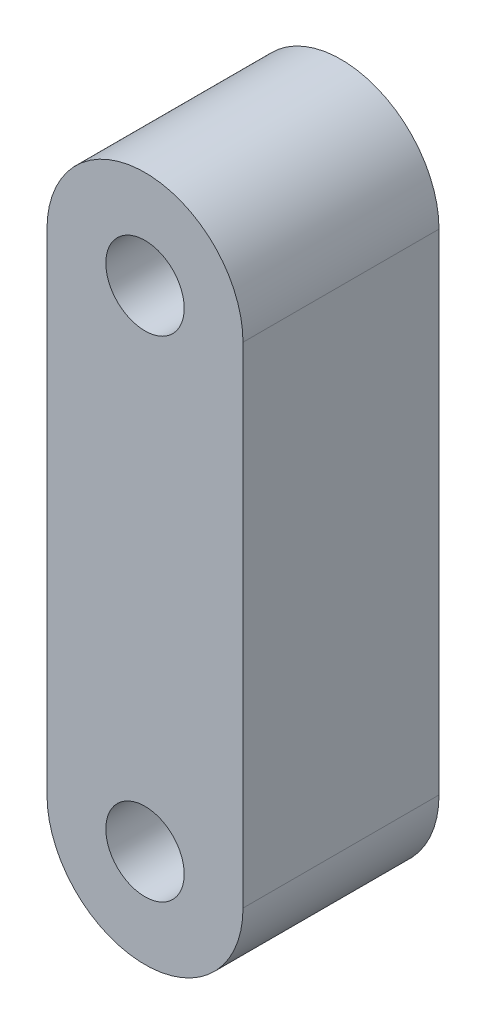
ISO-10303-21;
HEADER;
FILE_DESCRIPTION(('STEP AP214'),'2;1');
FILE_NAME('part.step','',(''),(''),'','','');
FILE_SCHEMA(('AUTOMOTIVE_DESIGN { 1 0 10303 214 1 1 1 1 }'));
ENDSEC;
DATA;
#1=APPLICATION_CONTEXT('core data for automotive mechanical design processes');
#2=APPLICATION_PROTOCOL_DEFINITION('international standard','automotive_design',2000,#1);
#3=PRODUCT_CONTEXT('',#1,'mechanical');
#4=PRODUCT('Part','Part','',(#3));
#5=PRODUCT_RELATED_PRODUCT_CATEGORY('part','',(#4));
#6=PRODUCT_DEFINITION_FORMATION('','',#4);
#7=PRODUCT_DEFINITION_CONTEXT('part definition',#1,'design');
#8=PRODUCT_DEFINITION('design','',#6,#7);
#9=PRODUCT_DEFINITION_SHAPE('','',#8);
#10=(LENGTH_UNIT() NAMED_UNIT(*) SI_UNIT(.MILLI.,.METRE.));
#11=(NAMED_UNIT(*) PLANE_ANGLE_UNIT() SI_UNIT($,.RADIAN.));
#12=(NAMED_UNIT(*) SI_UNIT($,.STERADIAN.) SOLID_ANGLE_UNIT());
#13=UNCERTAINTY_MEASURE_WITH_UNIT(LENGTH_MEASURE(1.E-05),#10,'distance_accuracy_value','');
#14=(GEOMETRIC_REPRESENTATION_CONTEXT(3) GLOBAL_UNCERTAINTY_ASSIGNED_CONTEXT((#13)) GLOBAL_UNIT_ASSIGNED_CONTEXT((#10,
#11,#12)) REPRESENTATION_CONTEXT('',''));
#15=CARTESIAN_POINT('',(0.,0.,0.));
#16=DIRECTION('',(0.,0.,1.));
#17=DIRECTION('',(1.,0.,0.));
#18=AXIS2_PLACEMENT_3D('',#15,#16,#17);
#19=CARTESIAN_POINT('',(0.,0.,20.));
#20=DIRECTION('',(0.,0.,1.));
#21=DIRECTION('',(1.,0.,0.));
#22=AXIS2_PLACEMENT_3D('',#19,#20,#21);
#23=PLANE('',#22);
#24=CARTESIAN_POINT('',(0.,50.,20.));
#25=DIRECTION('',(0.,0.,1.));
#26=DIRECTION('',(1.,0.,0.));
#27=AXIS2_PLACEMENT_3D('',#24,#25,#26);
#28=CIRCLE('',#27,4.);
#29=CARTESIAN_POINT('',(4.,50.,20.));
#30=VERTEX_POINT('',#29);
#31=EDGE_CURVE('E106',#30,#30,#28,.T.);
#32=ORIENTED_EDGE('',*,*,#31,.F.);
#33=EDGE_LOOP('',(#32));
#34=FACE_BOUND('',#33,.T.);
#35=CARTESIAN_POINT('',(0.,0.,20.));
#36=DIRECTION('',(0.,0.,1.));
#37=DIRECTION('',(1.,0.,0.));
#38=AXIS2_PLACEMENT_3D('',#35,#36,#37);
#39=CIRCLE('',#38,10.);
#40=CARTESIAN_POINT('',(-10.,0.,20.));
#41=VERTEX_POINT('',#40);
#42=CARTESIAN_POINT('',(10.,0.,20.));
#43=VERTEX_POINT('',#42);
#44=EDGE_CURVE('E91',#41,#43,#39,.T.);
#45=ORIENTED_EDGE('',*,*,#44,.T.);
#46=DIRECTION('',(0.,1.,0.));
#47=VECTOR('',#46,1.);
#48=CARTESIAN_POINT('',(10.,0.,20.));
#49=LINE('',#48,#47);
#50=CARTESIAN_POINT('',(10.,50.,20.));
#51=VERTEX_POINT('',#50);
#52=EDGE_CURVE('E86',#43,#51,#49,.T.);
#53=ORIENTED_EDGE('',*,*,#52,.T.);
#54=CARTESIAN_POINT('',(0.,50.,20.));
#55=DIRECTION('',(0.,0.,1.));
#56=DIRECTION('',(1.,0.,0.));
#57=AXIS2_PLACEMENT_3D('',#54,#55,#56);
#58=CIRCLE('',#57,10.);
#59=CARTESIAN_POINT('',(-10.,50.,20.));
#60=VERTEX_POINT('',#59);
#61=EDGE_CURVE('E89',#51,#60,#58,.T.);
#62=ORIENTED_EDGE('',*,*,#61,.T.);
#63=DIRECTION('',(0.,-1.,0.));
#64=VECTOR('',#63,1.);
#65=CARTESIAN_POINT('',(-10.,0.,20.));
#66=LINE('',#65,#64);
#67=EDGE_CURVE('E56',#60,#41,#66,.T.);
#68=ORIENTED_EDGE('',*,*,#67,.T.);
#69=EDGE_LOOP('',(#45,#53,#62,#68));
#70=FACE_BOUND('',#69,.T.);
#71=CARTESIAN_POINT('',(0.,0.,20.));
#72=DIRECTION('',(0.,0.,1.));
#73=DIRECTION('',(1.,0.,0.));
#74=AXIS2_PLACEMENT_3D('',#71,#72,#73);
#75=CIRCLE('',#74,4.);
#76=CARTESIAN_POINT('',(4.,0.,20.));
#77=VERTEX_POINT('',#76);
#78=EDGE_CURVE('E121',#77,#77,#75,.T.);
#79=ORIENTED_EDGE('',*,*,#78,.F.);
#80=EDGE_LOOP('',(#79));
#81=FACE_BOUND('',#80,.T.);
#82=ADVANCED_FACE('F39',(#34,#70,#81),#23,.T.);
#83=CARTESIAN_POINT('',(0.,0.,0.));
#84=DIRECTION('',(0.,0.,1.));
#85=DIRECTION('',(1.,0.,0.));
#86=AXIS2_PLACEMENT_3D('',#83,#84,#85);
#87=PLANE('',#86);
#88=CARTESIAN_POINT('',(0.,0.,0.));
#89=DIRECTION('',(0.,0.,1.));
#90=DIRECTION('',(1.,0.,0.));
#91=AXIS2_PLACEMENT_3D('',#88,#89,#90);
#92=CIRCLE('',#91,10.);
#93=CARTESIAN_POINT('',(-10.,0.,0.));
#94=VERTEX_POINT('',#93);
#95=CARTESIAN_POINT('',(10.,0.,0.));
#96=VERTEX_POINT('',#95);
#97=EDGE_CURVE('E103',#94,#96,#92,.T.);
#98=ORIENTED_EDGE('',*,*,#97,.F.);
#99=DIRECTION('',(0.,-1.,0.));
#100=VECTOR('',#99,1.);
#101=CARTESIAN_POINT('',(-10.,0.,0.));
#102=LINE('',#101,#100);
#103=CARTESIAN_POINT('',(-10.,50.,0.));
#104=VERTEX_POINT('',#103);
#105=EDGE_CURVE('E79',#104,#94,#102,.T.);
#106=ORIENTED_EDGE('',*,*,#105,.F.);
#107=CARTESIAN_POINT('',(0.,50.,0.));
#108=DIRECTION('',(0.,0.,1.));
#109=DIRECTION('',(1.,0.,0.));
#110=AXIS2_PLACEMENT_3D('',#107,#108,#109);
#111=CIRCLE('',#110,10.);
#112=CARTESIAN_POINT('',(10.,50.,0.));
#113=VERTEX_POINT('',#112);
#114=EDGE_CURVE('E73',#113,#104,#111,.T.);
#115=ORIENTED_EDGE('',*,*,#114,.F.);
#116=DIRECTION('',(0.,1.,0.));
#117=VECTOR('',#116,1.);
#118=CARTESIAN_POINT('',(10.,0.,0.));
#119=LINE('',#118,#117);
#120=EDGE_CURVE('E95',#96,#113,#119,.T.);
#121=ORIENTED_EDGE('',*,*,#120,.F.);
#122=EDGE_LOOP('',(#98,#106,#115,#121));
#123=FACE_BOUND('',#122,.T.);
#124=CARTESIAN_POINT('',(0.,50.,0.));
#125=DIRECTION('',(0.,0.,1.));
#126=DIRECTION('',(1.,0.,0.));
#127=AXIS2_PLACEMENT_3D('',#124,#125,#126);
#128=CIRCLE('',#127,4.);
#129=CARTESIAN_POINT('',(4.,50.,0.));
#130=VERTEX_POINT('',#129);
#131=EDGE_CURVE('E118',#130,#130,#128,.T.);
#132=ORIENTED_EDGE('',*,*,#131,.T.);
#133=EDGE_LOOP('',(#132));
#134=FACE_BOUND('',#133,.T.);
#135=CARTESIAN_POINT('',(0.,0.,0.));
#136=DIRECTION('',(0.,0.,1.));
#137=DIRECTION('',(1.,0.,0.));
#138=AXIS2_PLACEMENT_3D('',#135,#136,#137);
#139=CIRCLE('',#138,4.);
#140=CARTESIAN_POINT('',(4.,0.,0.));
#141=VERTEX_POINT('',#140);
#142=EDGE_CURVE('E124',#141,#141,#139,.T.);
#143=ORIENTED_EDGE('',*,*,#142,.T.);
#144=EDGE_LOOP('',(#143));
#145=FACE_BOUND('',#144,.T.);
#146=ADVANCED_FACE('F114',(#123,#134,#145),#87,.F.);
#147=CARTESIAN_POINT('',(0.,0.,20.));
#148=DIRECTION('',(0.,0.,-1.));
#149=DIRECTION('',(-1.,0.,0.));
#150=AXIS2_PLACEMENT_3D('',#147,#148,#149);
#151=CYLINDRICAL_SURFACE('',#150,10.);
#152=ORIENTED_EDGE('',*,*,#97,.T.);
#153=DIRECTION('',(0.,0.,-1.));
#154=VECTOR('',#153,1.);
#155=CARTESIAN_POINT('',(10.,0.,20.));
#156=LINE('',#155,#154);
#157=EDGE_CURVE('E11',#43,#96,#156,.T.);
#158=ORIENTED_EDGE('',*,*,#157,.F.);
#159=ORIENTED_EDGE('',*,*,#44,.F.);
#160=DIRECTION('',(0.,0.,-1.));
#161=VECTOR('',#160,1.);
#162=CARTESIAN_POINT('',(-10.,0.,20.));
#163=LINE('',#162,#161);
#164=EDGE_CURVE('E99',#41,#94,#163,.T.);
#165=ORIENTED_EDGE('',*,*,#164,.T.);
#166=EDGE_LOOP('',(#152,#158,#159,#165));
#167=FACE_BOUND('',#166,.T.);
#168=ADVANCED_FACE('F41',(#167),#151,.T.);
#169=CARTESIAN_POINT('',(10.,0.,20.));
#170=DIRECTION('',(-1.,0.,0.));
#171=DIRECTION('',(0.,0.,1.));
#172=AXIS2_PLACEMENT_3D('',#169,#170,#171);
#173=PLANE('',#172);
#174=ORIENTED_EDGE('',*,*,#120,.T.);
#175=DIRECTION('',(0.,0.,-1.));
#176=VECTOR('',#175,1.);
#177=CARTESIAN_POINT('',(10.,50.,20.));
#178=LINE('',#177,#176);
#179=EDGE_CURVE('E48',#51,#113,#178,.T.);
#180=ORIENTED_EDGE('',*,*,#179,.F.);
#181=ORIENTED_EDGE('',*,*,#52,.F.);
#182=ORIENTED_EDGE('',*,*,#157,.T.);
#183=EDGE_LOOP('',(#174,#180,#181,#182));
#184=FACE_BOUND('',#183,.T.);
#185=ADVANCED_FACE('F94',(#184),#173,.F.);
#186=CARTESIAN_POINT('',(0.,50.,20.));
#187=DIRECTION('',(0.,0.,-1.));
#188=DIRECTION('',(-1.,0.,0.));
#189=AXIS2_PLACEMENT_3D('',#186,#187,#188);
#190=CYLINDRICAL_SURFACE('',#189,10.);
#191=ORIENTED_EDGE('',*,*,#114,.T.);
#192=DIRECTION('',(0.,0.,-1.));
#193=VECTOR('',#192,1.);
#194=CARTESIAN_POINT('',(-10.,50.,20.));
#195=LINE('',#194,#193);
#196=EDGE_CURVE('E96',#60,#104,#195,.T.);
#197=ORIENTED_EDGE('',*,*,#196,.F.);
#198=ORIENTED_EDGE('',*,*,#61,.F.);
#199=ORIENTED_EDGE('',*,*,#179,.T.);
#200=EDGE_LOOP('',(#191,#197,#198,#199));
#201=FACE_BOUND('',#200,.T.);
#202=ADVANCED_FACE('F97',(#201),#190,.T.);
#203=CARTESIAN_POINT('',(-10.,0.,20.));
#204=DIRECTION('',(1.,0.,0.));
#205=DIRECTION('',(0.,0.,-1.));
#206=AXIS2_PLACEMENT_3D('',#203,#204,#205);
#207=PLANE('',#206);
#208=ORIENTED_EDGE('',*,*,#105,.T.);
#209=ORIENTED_EDGE('',*,*,#164,.F.);
#210=ORIENTED_EDGE('',*,*,#67,.F.);
#211=ORIENTED_EDGE('',*,*,#196,.T.);
#212=EDGE_LOOP('',(#208,#209,#210,#211));
#213=FACE_BOUND('',#212,.T.);
#214=ADVANCED_FACE('F111',(#213),#207,.F.);
#215=CARTESIAN_POINT('',(0.,50.,20.));
#216=DIRECTION('',(0.,0.,-1.));
#217=DIRECTION('',(-1.,0.,0.));
#218=AXIS2_PLACEMENT_3D('',#215,#216,#217);
#219=CYLINDRICAL_SURFACE('',#218,4.);
#220=ORIENTED_EDGE('',*,*,#31,.T.);
#221=EDGE_LOOP('',(#220));
#222=FACE_BOUND('',#221,.T.);
#223=ORIENTED_EDGE('',*,*,#131,.F.);
#224=EDGE_LOOP('',(#223));
#225=FACE_BOUND('',#224,.T.);
#226=ADVANCED_FACE('F141',(#222,#225),#219,.F.);
#227=CARTESIAN_POINT('',(0.,0.,20.));
#228=DIRECTION('',(0.,0.,-1.));
#229=DIRECTION('',(-1.,0.,0.));
#230=AXIS2_PLACEMENT_3D('',#227,#228,#229);
#231=CYLINDRICAL_SURFACE('',#230,4.);
#232=ORIENTED_EDGE('',*,*,#78,.T.);
#233=EDGE_LOOP('',(#232));
#234=FACE_BOUND('',#233,.T.);
#235=ORIENTED_EDGE('',*,*,#142,.F.);
#236=EDGE_LOOP('',(#235));
#237=FACE_BOUND('',#236,.T.);
#238=ADVANCED_FACE('F130',(#234,#237),#231,.F.);
#239=CLOSED_SHELL('',(#82,#146,#168,#185,#202,#214,#226,#238));
#240=MANIFOLD_SOLID_BREP('B2',#239);
#241=ADVANCED_BREP_SHAPE_REPRESENTATION('',(#18,#240),#14);
#242=SHAPE_DEFINITION_REPRESENTATION(#9,#241);
ENDSEC;
END-ISO-10303-21;
